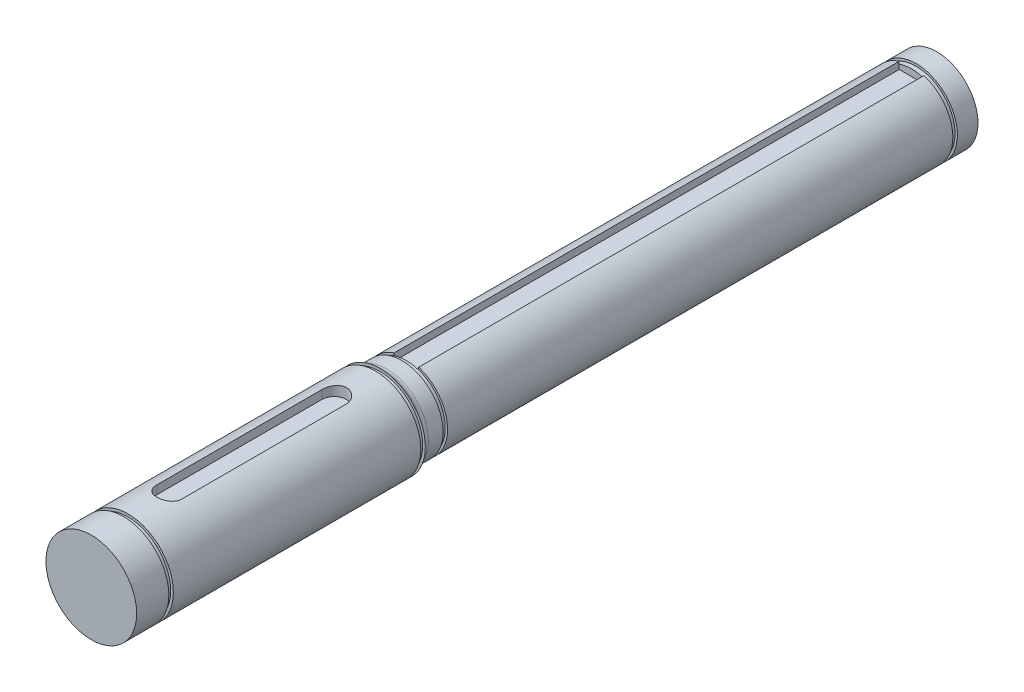
ISO-10303-21;
HEADER;
FILE_DESCRIPTION(('STEP AP214'),'2;1');
FILE_NAME('part.step','',(''),(''),'','','');
FILE_SCHEMA(('AUTOMOTIVE_DESIGN { 1 0 10303 214 1 1 1 1 }'));
ENDSEC;
DATA;
#1=APPLICATION_CONTEXT('core data for automotive mechanical design processes');
#2=APPLICATION_PROTOCOL_DEFINITION('international standard','automotive_design',2000,#1);
#3=PRODUCT_CONTEXT('',#1,'mechanical');
#4=PRODUCT('Part','Part','',(#3));
#5=PRODUCT_RELATED_PRODUCT_CATEGORY('part','',(#4));
#6=PRODUCT_DEFINITION_FORMATION('','',#4);
#7=PRODUCT_DEFINITION_CONTEXT('part definition',#1,'design');
#8=PRODUCT_DEFINITION('design','',#6,#7);
#9=PRODUCT_DEFINITION_SHAPE('','',#8);
#10=(LENGTH_UNIT() NAMED_UNIT(*) SI_UNIT(.MILLI.,.METRE.));
#11=(NAMED_UNIT(*) PLANE_ANGLE_UNIT() SI_UNIT($,.RADIAN.));
#12=(NAMED_UNIT(*) SI_UNIT($,.STERADIAN.) SOLID_ANGLE_UNIT());
#13=UNCERTAINTY_MEASURE_WITH_UNIT(LENGTH_MEASURE(1.E-05),#10,'distance_accuracy_value','');
#14=(GEOMETRIC_REPRESENTATION_CONTEXT(3) GLOBAL_UNCERTAINTY_ASSIGNED_CONTEXT((#13)) GLOBAL_UNIT_ASSIGNED_CONTEXT((#10,
#11,#12)) REPRESENTATION_CONTEXT('',''));
#15=CARTESIAN_POINT('',(0.,0.,0.));
#16=DIRECTION('',(0.,0.,1.));
#17=DIRECTION('',(1.,0.,0.));
#18=AXIS2_PLACEMENT_3D('',#15,#16,#17);
#19=CARTESIAN_POINT('',(0.,0.,135.));
#20=DIRECTION('',(0.,0.,-1.));
#21=DIRECTION('',(-1.,0.,0.));
#22=AXIS2_PLACEMENT_3D('',#19,#20,#21);
#23=CYLINDRICAL_SURFACE('',#22,10.);
#24=CARTESIAN_POINT('',(0.,0.,128.6));
#25=DIRECTION('',(0.,0.,-1.));
#26=DIRECTION('',(-1.,0.,0.));
#27=AXIS2_PLACEMENT_3D('',#24,#25,#26);
#28=CIRCLE('',#27,10.);
#29=CARTESIAN_POINT('',(3.,9.53939201416946,128.6));
#30=VERTEX_POINT('',#29);
#31=CARTESIAN_POINT('',(-3.,9.53939201416946,128.6));
#32=VERTEX_POINT('',#31);
#33=EDGE_CURVE('E240',#30,#32,#28,.T.);
#34=ORIENTED_EDGE('',*,*,#33,.T.);
#35=DIRECTION('',(0.,0.,-1.));
#36=VECTOR('',#35,1.);
#37=CARTESIAN_POINT('',(-3.,9.53939201416946,135.));
#38=LINE('',#37,#36);
#39=CARTESIAN_POINT('',(-3.,9.53939201416946,6.10000000000001));
#40=VERTEX_POINT('',#39);
#41=EDGE_CURVE('E227',#32,#40,#38,.T.);
#42=ORIENTED_EDGE('',*,*,#41,.T.);
#43=CARTESIAN_POINT('',(0.,0.,6.1));
#44=DIRECTION('',(0.,0.,-1.));
#45=DIRECTION('',(-1.,0.,0.));
#46=AXIS2_PLACEMENT_3D('',#43,#44,#45);
#47=CIRCLE('',#46,10.);
#48=CARTESIAN_POINT('',(3.,9.53939201416946,6.10000000000001));
#49=VERTEX_POINT('',#48);
#50=EDGE_CURVE('E257',#49,#40,#47,.T.);
#51=ORIENTED_EDGE('',*,*,#50,.F.);
#52=DIRECTION('',(0.,0.,-1.));
#53=VECTOR('',#52,1.);
#54=CARTESIAN_POINT('',(3.,9.53939201416946,135.));
#55=LINE('',#54,#53);
#56=EDGE_CURVE('E220',#49,#30,#55,.F.);
#57=ORIENTED_EDGE('',*,*,#56,.T.);
#58=EDGE_LOOP('',(#34,#42,#51,#57));
#59=FACE_BOUND('',#58,.T.);
#60=ADVANCED_FACE('F39',(#59),#23,.T.);
#61=CARTESIAN_POINT('',(0.,0.,6.1));
#62=DIRECTION('',(0.,0.,-1.));
#63=DIRECTION('',(-1.,0.,0.));
#64=AXIS2_PLACEMENT_3D('',#61,#62,#63);
#65=PLANE('',#64);
#66=DIRECTION('',(0.,1.,0.));
#67=VECTOR('',#66,1.);
#68=CARTESIAN_POINT('',(-3.,10.8777926354471,6.10000000000001));
#69=LINE('',#68,#67);
#70=CARTESIAN_POINT('',(-3.,8.94007270663947,6.10000000000001));
#71=VERTEX_POINT('',#70);
#72=EDGE_CURVE('E193',#71,#40,#69,.T.);
#73=ORIENTED_EDGE('',*,*,#72,.F.);
#74=CARTESIAN_POINT('',(0.,0.,6.1));
#75=DIRECTION('',(0.,0.,-1.));
#76=DIRECTION('',(-1.,0.,0.));
#77=AXIS2_PLACEMENT_3D('',#74,#75,#76);
#78=CIRCLE('',#77,9.43);
#79=CARTESIAN_POINT('',(3.,8.94007270663947,6.10000000000001));
#80=VERTEX_POINT('',#79);
#81=EDGE_CURVE('E253',#80,#71,#78,.T.);
#82=ORIENTED_EDGE('',*,*,#81,.F.);
#83=DIRECTION('',(0.,-1.,0.));
#84=VECTOR('',#83,1.);
#85=CARTESIAN_POINT('',(3.,7.81,6.10000000000001));
#86=LINE('',#85,#84);
#87=EDGE_CURVE('E212',#49,#80,#86,.T.);
#88=ORIENTED_EDGE('',*,*,#87,.F.);
#89=ORIENTED_EDGE('',*,*,#50,.T.);
#90=EDGE_LOOP('',(#73,#82,#88,#89));
#91=FACE_BOUND('',#90,.T.);
#92=ADVANCED_FACE('F335',(#91),#65,.T.);
#93=CARTESIAN_POINT('',(0.,0.,5.));
#94=DIRECTION('',(0.,0.,-1.));
#95=DIRECTION('',(-1.,0.,0.));
#96=AXIS2_PLACEMENT_3D('',#93,#94,#95);
#97=PLANE('',#96);
#98=CARTESIAN_POINT('',(0.,0.,5.));
#99=DIRECTION('',(0.,0.,-1.));
#100=DIRECTION('',(-1.,0.,0.));
#101=AXIS2_PLACEMENT_3D('',#98,#99,#100);
#102=CIRCLE('',#101,9.43);
#103=CARTESIAN_POINT('',(-9.43,0.,5.));
#104=VERTEX_POINT('',#103);
#105=EDGE_CURVE('E244',#104,#104,#102,.T.);
#106=ORIENTED_EDGE('',*,*,#105,.T.);
#107=EDGE_LOOP('',(#106));
#108=FACE_BOUND('',#107,.T.);
#109=CARTESIAN_POINT('',(0.,0.,5.));
#110=DIRECTION('',(0.,0.,-1.));
#111=DIRECTION('',(-1.,0.,0.));
#112=AXIS2_PLACEMENT_3D('',#109,#110,#111);
#113=CIRCLE('',#112,10.);
#114=CARTESIAN_POINT('',(-10.,0.,5.));
#115=VERTEX_POINT('',#114);
#116=EDGE_CURVE('E252',#115,#115,#113,.T.);
#117=ORIENTED_EDGE('',*,*,#116,.F.);
#118=EDGE_LOOP('',(#117));
#119=FACE_BOUND('',#118,.T.);
#120=ADVANCED_FACE('F342',(#108,#119),#97,.F.);
#121=CARTESIAN_POINT('',(0.,0.,6.1));
#122=DIRECTION('',(0.,0.,-1.));
#123=DIRECTION('',(-1.,0.,0.));
#124=AXIS2_PLACEMENT_3D('',#121,#122,#123);
#125=CYLINDRICAL_SURFACE('',#124,9.43);
#126=EDGE_CURVE('E248',#71,#80,#78,.T.);
#127=ORIENTED_EDGE('',*,*,#126,.T.);
#128=ORIENTED_EDGE('',*,*,#81,.T.);
#129=EDGE_LOOP('',(#127,#128));
#130=FACE_BOUND('',#129,.T.);
#131=ORIENTED_EDGE('',*,*,#105,.F.);
#132=EDGE_LOOP('',(#131));
#133=FACE_BOUND('',#132,.T.);
#134=ADVANCED_FACE('F361',(#130,#133),#125,.T.);
#135=CARTESIAN_POINT('',(0.,0.,0.));
#136=DIRECTION('',(0.,0.,1.));
#137=DIRECTION('',(1.,0.,0.));
#138=AXIS2_PLACEMENT_3D('',#135,#136,#137);
#139=PLANE('',#138);
#140=CARTESIAN_POINT('',(0.,0.,0.));
#141=DIRECTION('',(0.,0.,1.));
#142=DIRECTION('',(1.,0.,0.));
#143=AXIS2_PLACEMENT_3D('',#140,#141,#142);
#144=CIRCLE('',#143,10.);
#145=CARTESIAN_POINT('',(10.,0.,0.));
#146=VERTEX_POINT('',#145);
#147=EDGE_CURVE('E261',#146,#146,#144,.T.);
#148=ORIENTED_EDGE('',*,*,#147,.F.);
#149=EDGE_LOOP('',(#148));
#150=FACE_BOUND('',#149,.T.);
#151=ADVANCED_FACE('F352',(#150),#139,.F.);
#152=ORIENTED_EDGE('',*,*,#116,.T.);
#153=EDGE_LOOP('',(#152));
#154=FACE_BOUND('',#153,.T.);
#155=ORIENTED_EDGE('',*,*,#147,.T.);
#156=EDGE_LOOP('',(#155));
#157=FACE_BOUND('',#156,.T.);
#158=ADVANCED_FACE('F338',(#154,#157),#23,.T.);
#159=CARTESIAN_POINT('',(0.,0.,128.6));
#160=DIRECTION('',(0.,0.,1.));
#161=DIRECTION('',(-1.,0.,0.));
#162=AXIS2_PLACEMENT_3D('',#159,#160,#161);
#163=PLANE('',#162);
#164=DIRECTION('',(0.,1.,0.));
#165=VECTOR('',#164,1.);
#166=CARTESIAN_POINT('',(-3.,10.8777926354471,128.6));
#167=LINE('',#166,#165);
#168=CARTESIAN_POINT('',(-3.,8.94007270663947,128.6));
#169=VERTEX_POINT('',#168);
#170=EDGE_CURVE('E197',#169,#32,#167,.T.);
#171=ORIENTED_EDGE('',*,*,#170,.T.);
#172=ORIENTED_EDGE('',*,*,#33,.F.);
#173=DIRECTION('',(0.,-1.,0.));
#174=VECTOR('',#173,1.);
#175=CARTESIAN_POINT('',(3.,7.81,128.6));
#176=LINE('',#175,#174);
#177=CARTESIAN_POINT('',(3.,8.94007270663947,128.6));
#178=VERTEX_POINT('',#177);
#179=EDGE_CURVE('E200',#30,#178,#176,.T.);
#180=ORIENTED_EDGE('',*,*,#179,.T.);
#181=CARTESIAN_POINT('',(0.,0.,128.6));
#182=DIRECTION('',(0.,0.,-1.));
#183=DIRECTION('',(-1.,0.,0.));
#184=AXIS2_PLACEMENT_3D('',#181,#182,#183);
#185=CIRCLE('',#184,9.43);
#186=EDGE_CURVE('E236',#178,#169,#185,.T.);
#187=ORIENTED_EDGE('',*,*,#186,.T.);
#188=EDGE_LOOP('',(#171,#172,#180,#187));
#189=FACE_BOUND('',#188,.T.);
#190=ADVANCED_FACE('F351',(#189),#163,.T.);
#191=CARTESIAN_POINT('',(0.,0.,129.7));
#192=DIRECTION('',(0.,0.,1.));
#193=DIRECTION('',(-1.,0.,0.));
#194=AXIS2_PLACEMENT_3D('',#191,#192,#193);
#195=PLANE('',#194);
#196=CARTESIAN_POINT('',(0.,0.,129.7));
#197=DIRECTION('',(0.,0.,-1.));
#198=DIRECTION('',(-1.,0.,0.));
#199=AXIS2_PLACEMENT_3D('',#196,#197,#198);
#200=CIRCLE('',#199,10.);
#201=CARTESIAN_POINT('',(-10.,0.,129.7));
#202=VERTEX_POINT('',#201);
#203=EDGE_CURVE('E235',#202,#202,#200,.T.);
#204=ORIENTED_EDGE('',*,*,#203,.T.);
#205=EDGE_LOOP('',(#204));
#206=FACE_BOUND('',#205,.T.);
#207=CARTESIAN_POINT('',(0.,0.,129.7));
#208=DIRECTION('',(0.,0.,-1.));
#209=DIRECTION('',(-1.,0.,0.));
#210=AXIS2_PLACEMENT_3D('',#207,#208,#209);
#211=CIRCLE('',#210,9.43);
#212=CARTESIAN_POINT('',(-9.43,0.,129.7));
#213=VERTEX_POINT('',#212);
#214=EDGE_CURVE('E231',#213,#213,#211,.T.);
#215=ORIENTED_EDGE('',*,*,#214,.F.);
#216=EDGE_LOOP('',(#215));
#217=FACE_BOUND('',#216,.T.);
#218=ADVANCED_FACE('F358',(#206,#217),#195,.F.);
#219=CARTESIAN_POINT('',(0.,0.,128.6));
#220=DIRECTION('',(0.,0.,1.));
#221=DIRECTION('',(1.,0.,0.));
#222=AXIS2_PLACEMENT_3D('',#219,#220,#221);
#223=CYLINDRICAL_SURFACE('',#222,9.43);
#224=EDGE_CURVE('E232',#169,#178,#185,.T.);
#225=ORIENTED_EDGE('',*,*,#224,.F.);
#226=ORIENTED_EDGE('',*,*,#186,.F.);
#227=EDGE_LOOP('',(#225,#226));
#228=FACE_BOUND('',#227,.T.);
#229=ORIENTED_EDGE('',*,*,#214,.T.);
#230=EDGE_LOOP('',(#229));
#231=FACE_BOUND('',#230,.T.);
#232=ADVANCED_FACE('F348',(#228,#231),#223,.T.);
#233=CARTESIAN_POINT('',(0.,0.,133.267949192431));
#234=DIRECTION('',(0.,0.,1.));
#235=DIRECTION('',(1.,0.,0.));
#236=AXIS2_PLACEMENT_3D('',#233,#234,#235);
#237=CIRCLE('',#236,10.);
#238=CARTESIAN_POINT('',(10.,0.,133.267949192431));
#239=VERTEX_POINT('',#238);
#240=EDGE_CURVE('E268',#239,#239,#237,.F.);
#241=ORIENTED_EDGE('',*,*,#240,.T.);
#242=EDGE_LOOP('',(#241));
#243=FACE_BOUND('',#242,.T.);
#244=ORIENTED_EDGE('',*,*,#203,.F.);
#245=EDGE_LOOP('',(#244));
#246=FACE_BOUND('',#245,.T.);
#247=ADVANCED_FACE('F337',(#243,#246),#23,.T.);
#248=CARTESIAN_POINT('',(-3.,10.8777926354471,128.6));
#249=DIRECTION('',(-1.,0.,0.));
#250=DIRECTION('',(0.,0.,1.));
#251=AXIS2_PLACEMENT_3D('',#248,#249,#250);
#252=PLANE('',#251);
#253=ORIENTED_EDGE('',*,*,#170,.F.);
#254=CARTESIAN_POINT('',(-3.,7.81,128.6));
#255=VERTEX_POINT('',#254);
#256=EDGE_CURVE('E63',#255,#169,#167,.T.);
#257=ORIENTED_EDGE('',*,*,#256,.F.);
#258=DIRECTION('',(0.,0.,-1.));
#259=VECTOR('',#258,1.);
#260=CARTESIAN_POINT('',(-3.,7.81,128.6));
#261=LINE('',#260,#259);
#262=CARTESIAN_POINT('',(-3.,7.81,6.10000000000001));
#263=VERTEX_POINT('',#262);
#264=EDGE_CURVE('E217',#255,#263,#261,.T.);
#265=ORIENTED_EDGE('',*,*,#264,.T.);
#266=EDGE_CURVE('E205',#263,#71,#69,.T.);
#267=ORIENTED_EDGE('',*,*,#266,.T.);
#268=ORIENTED_EDGE('',*,*,#72,.T.);
#269=ORIENTED_EDGE('',*,*,#41,.F.);
#270=EDGE_LOOP('',(#253,#257,#265,#267,#268,#269));
#271=FACE_BOUND('',#270,.T.);
#272=ADVANCED_FACE('F347',(#271),#252,.F.);
#273=CARTESIAN_POINT('',(3.,7.81,128.6));
#274=DIRECTION('',(1.,0.,0.));
#275=DIRECTION('',(0.,0.,-1.));
#276=AXIS2_PLACEMENT_3D('',#273,#274,#275);
#277=PLANE('',#276);
#278=ORIENTED_EDGE('',*,*,#87,.T.);
#279=CARTESIAN_POINT('',(3.,7.81,6.10000000000001));
#280=VERTEX_POINT('',#279);
#281=EDGE_CURVE('E209',#80,#280,#86,.T.);
#282=ORIENTED_EDGE('',*,*,#281,.T.);
#283=DIRECTION('',(0.,0.,-1.));
#284=VECTOR('',#283,1.);
#285=CARTESIAN_POINT('',(3.,7.81,128.6));
#286=LINE('',#285,#284);
#287=CARTESIAN_POINT('',(3.,7.81,128.6));
#288=VERTEX_POINT('',#287);
#289=EDGE_CURVE('E204',#288,#280,#286,.T.);
#290=ORIENTED_EDGE('',*,*,#289,.F.);
#291=EDGE_CURVE('E196',#178,#288,#176,.T.);
#292=ORIENTED_EDGE('',*,*,#291,.F.);
#293=ORIENTED_EDGE('',*,*,#179,.F.);
#294=ORIENTED_EDGE('',*,*,#56,.F.);
#295=EDGE_LOOP('',(#278,#282,#290,#292,#293,#294));
#296=FACE_BOUND('',#295,.T.);
#297=ADVANCED_FACE('F384',(#296),#277,.F.);
#298=CARTESIAN_POINT('',(0.,0.,128.6));
#299=DIRECTION('',(0.,0.,-1.));
#300=DIRECTION('',(-1.,0.,0.));
#301=AXIS2_PLACEMENT_3D('',#298,#299,#300);
#302=PLANE('',#301);
#303=ORIENTED_EDGE('',*,*,#224,.T.);
#304=ORIENTED_EDGE('',*,*,#291,.T.);
#305=DIRECTION('',(-1.,0.,0.));
#306=VECTOR('',#305,1.);
#307=CARTESIAN_POINT('',(3.,7.81,128.6));
#308=LINE('',#307,#306);
#309=EDGE_CURVE('E201',#288,#255,#308,.T.);
#310=ORIENTED_EDGE('',*,*,#309,.T.);
#311=ORIENTED_EDGE('',*,*,#256,.T.);
#312=EDGE_LOOP('',(#303,#304,#310,#311));
#313=FACE_BOUND('',#312,.T.);
#314=ADVANCED_FACE('F388',(#313),#302,.T.);
#315=CARTESIAN_POINT('',(3.,7.81,128.6));
#316=DIRECTION('',(0.,-1.,0.));
#317=DIRECTION('',(1.,0.,0.));
#318=AXIS2_PLACEMENT_3D('',#315,#316,#317);
#319=PLANE('',#318);
#320=DIRECTION('',(-1.,0.,0.));
#321=VECTOR('',#320,1.);
#322=CARTESIAN_POINT('',(3.,7.81,6.10000000000001));
#323=LINE('',#322,#321);
#324=EDGE_CURVE('E213',#280,#263,#323,.T.);
#325=ORIENTED_EDGE('',*,*,#324,.T.);
#326=ORIENTED_EDGE('',*,*,#264,.F.);
#327=ORIENTED_EDGE('',*,*,#309,.F.);
#328=ORIENTED_EDGE('',*,*,#289,.T.);
#329=EDGE_LOOP('',(#325,#326,#327,#328));
#330=FACE_BOUND('',#329,.T.);
#331=ADVANCED_FACE('F390',(#330),#319,.F.);
#332=CARTESIAN_POINT('',(0.,0.,6.10000000000001));
#333=DIRECTION('',(0.,0.,-1.));
#334=DIRECTION('',(-1.,0.,0.));
#335=AXIS2_PLACEMENT_3D('',#332,#333,#334);
#336=PLANE('',#335);
#337=ORIENTED_EDGE('',*,*,#126,.F.);
#338=ORIENTED_EDGE('',*,*,#266,.F.);
#339=ORIENTED_EDGE('',*,*,#324,.F.);
#340=ORIENTED_EDGE('',*,*,#281,.F.);
#341=EDGE_LOOP('',(#337,#338,#339,#340));
#342=FACE_BOUND('',#341,.T.);
#343=ADVANCED_FACE('F393',(#342),#336,.F.);
#344=CARTESIAN_POINT('',(0.,0.,133.267949192431));
#345=DIRECTION('',(0.,0.,1.));
#346=DIRECTION('',(1.,0.,0.));
#347=AXIS2_PLACEMENT_3D('',#344,#345,#346);
#348=TOROIDAL_SURFACE('',#347,12.,2.);
#349=ORIENTED_EDGE('',*,*,#240,.F.);
#350=EDGE_LOOP('',(#349));
#351=FACE_BOUND('',#350,.T.);
#352=CARTESIAN_POINT('',(0.,0.,135.));
#353=DIRECTION('',(0.,0.,1.));
#354=DIRECTION('',(1.,0.,0.));
#355=AXIS2_PLACEMENT_3D('',#352,#353,#354);
#356=CIRCLE('',#355,11.);
#357=CARTESIAN_POINT('',(11.,0.,135.));
#358=VERTEX_POINT('',#357);
#359=EDGE_CURVE('E178',#358,#358,#356,.T.);
#360=ORIENTED_EDGE('',*,*,#359,.F.);
#361=EDGE_LOOP('',(#360));
#362=FACE_BOUND('',#361,.T.);
#363=ADVANCED_FACE('F41',(#351,#362),#348,.F.);
#364=CARTESIAN_POINT('',(0.,0.,136.1));
#365=DIRECTION('',(0.,0.,1.));
#366=DIRECTION('',(1.,0.,0.));
#367=AXIS2_PLACEMENT_3D('',#364,#365,#366);
#368=PLANE('',#367);
#369=CARTESIAN_POINT('',(0.,0.,136.1));
#370=DIRECTION('',(0.,0.,1.));
#371=DIRECTION('',(1.,0.,0.));
#372=AXIS2_PLACEMENT_3D('',#369,#370,#371);
#373=CIRCLE('',#372,11.);
#374=CARTESIAN_POINT('',(11.,0.,136.1));
#375=VERTEX_POINT('',#374);
#376=EDGE_CURVE('E182',#375,#375,#373,.T.);
#377=ORIENTED_EDGE('',*,*,#376,.F.);
#378=EDGE_LOOP('',(#377));
#379=FACE_BOUND('',#378,.T.);
#380=CARTESIAN_POINT('',(0.,0.,136.1));
#381=DIRECTION('',(0.,0.,1.));
#382=DIRECTION('',(1.,0.,0.));
#383=AXIS2_PLACEMENT_3D('',#380,#381,#382);
#384=CIRCLE('',#383,10.35);
#385=CARTESIAN_POINT('',(10.35,0.,136.1));
#386=VERTEX_POINT('',#385);
#387=EDGE_CURVE('E174',#386,#386,#384,.T.);
#388=ORIENTED_EDGE('',*,*,#387,.T.);
#389=EDGE_LOOP('',(#388));
#390=FACE_BOUND('',#389,.T.);
#391=ADVANCED_FACE('F322',(#379,#390),#368,.F.);
#392=CARTESIAN_POINT('',(0.,0.,135.));
#393=DIRECTION('',(0.,0.,1.));
#394=DIRECTION('',(1.,0.,0.));
#395=AXIS2_PLACEMENT_3D('',#392,#393,#394);
#396=PLANE('',#395);
#397=ORIENTED_EDGE('',*,*,#359,.T.);
#398=EDGE_LOOP('',(#397));
#399=FACE_BOUND('',#398,.T.);
#400=CARTESIAN_POINT('',(0.,0.,135.));
#401=DIRECTION('',(0.,0.,1.));
#402=DIRECTION('',(1.,0.,0.));
#403=AXIS2_PLACEMENT_3D('',#400,#401,#402);
#404=CIRCLE('',#403,10.35);
#405=CARTESIAN_POINT('',(10.35,0.,135.));
#406=VERTEX_POINT('',#405);
#407=EDGE_CURVE('E170',#406,#406,#404,.T.);
#408=ORIENTED_EDGE('',*,*,#407,.F.);
#409=EDGE_LOOP('',(#408));
#410=FACE_BOUND('',#409,.T.);
#411=ADVANCED_FACE('F320',(#399,#410),#396,.T.);
#412=CARTESIAN_POINT('',(0.,0.,136.1));
#413=DIRECTION('',(0.,0.,-1.));
#414=DIRECTION('',(-1.,0.,0.));
#415=AXIS2_PLACEMENT_3D('',#412,#413,#414);
#416=CYLINDRICAL_SURFACE('',#415,10.35);
#417=ORIENTED_EDGE('',*,*,#387,.F.);
#418=EDGE_LOOP('',(#417));
#419=FACE_BOUND('',#418,.T.);
#420=ORIENTED_EDGE('',*,*,#407,.T.);
#421=EDGE_LOOP('',(#420));
#422=FACE_BOUND('',#421,.T.);
#423=ADVANCED_FACE('F317',(#419,#422),#416,.T.);
#424=CARTESIAN_POINT('',(0.,0.,205.));
#425=DIRECTION('',(0.,0.,-1.));
#426=DIRECTION('',(-1.,0.,0.));
#427=AXIS2_PLACEMENT_3D('',#424,#425,#426);
#428=CYLINDRICAL_SURFACE('',#427,11.);
#429=DIRECTION('',(0.,0.,-1.));
#430=VECTOR('',#429,1.);
#431=CARTESIAN_POINT('',(3.00000000000001,10.5830052442584,205.));
#432=LINE('',#431,#430);
#433=CARTESIAN_POINT('',(3.,10.5830052442584,146.1));
#434=VERTEX_POINT('',#433);
#435=CARTESIAN_POINT('',(3.,10.5830052442584,186.1));
#436=VERTEX_POINT('',#435);
#437=EDGE_CURVE('E11',#434,#436,#432,.F.);
#438=ORIENTED_EDGE('',*,*,#437,.T.);
#439=CARTESIAN_POINT('',(3.,10.5830052442584,186.1));
#440=CARTESIAN_POINT('',(3.00000989976809,10.5829949970026,186.18269389141));
#441=CARTESIAN_POINT('',(2.99658102723595,10.5839742471726,186.265381704592));
#442=CARTESIAN_POINT('',(2.98292268314841,10.5878356752194,186.430133566229));
#443=CARTESIAN_POINT('',(2.97269452008914,10.5907174869552,186.512197731629));
#444=CARTESIAN_POINT('',(2.94554459027321,10.5982996181419,186.674942512145));
#445=CARTESIAN_POINT('',(2.9286377012691,10.6029958951229,186.755625789386));
#446=CARTESIAN_POINT('',(2.8882912071269,10.6140571066224,186.915203254054));
#447=CARTESIAN_POINT('',(2.8648514776895,10.6204220728906,186.994097407408));
#448=CARTESIAN_POINT('',(2.78500332821794,10.6417494872311,187.227242907164));
#449=CARTESIAN_POINT('',(2.71903526586308,10.6589535681767,187.378139394855));
#450=CARTESIAN_POINT('',(2.56365897700126,10.6973836998985,187.666705341769));
#451=CARTESIAN_POINT('',(2.47424245636571,10.7186111730805,187.804370097104));
#452=CARTESIAN_POINT('',(2.27200424315805,10.7633148792344,188.066209705979));
#453=CARTESIAN_POINT('',(2.15868225262836,10.7868322128172,188.189991878244));
#454=CARTESIAN_POINT('',(1.91292298422355,10.8331129950831,188.417051438905));
#455=CARTESIAN_POINT('',(1.78048258944452,10.8558763200935,188.520325477293));
#456=CARTESIAN_POINT('',(1.49749198480952,10.8985459264206,188.705098906746));
#457=CARTESIAN_POINT('',(1.34667477161623,10.9183977479742,188.786203079821));
#458=CARTESIAN_POINT('',(1.03291980522386,10.9525311229674,188.92174841378));
#459=CARTESIAN_POINT('',(0.869984764533401,10.9668139185607,188.976195521132));
#460=CARTESIAN_POINT('',(0.540744675896723,10.9879090070619,189.055601734903));
#461=CARTESIAN_POINT('',(0.374613167612539,10.9948916417093,189.081234326369));
#462=CARTESIAN_POINT('',(0.0402673813620262,11.0011960589752,189.104404664847));
#463=CARTESIAN_POINT('',(-0.127946573564688,11.0005190152883,189.101946716178));
#464=CARTESIAN_POINT('',(-0.45698092440425,10.9917041066205,189.069475124185));
#465=CARTESIAN_POINT('',(-0.617879308918083,10.9837634920705,189.040189973227));
#466=CARTESIAN_POINT('',(-0.932383527853141,10.9615477415639,188.956074784141));
#467=CARTESIAN_POINT('',(-1.08598900853898,10.9472722986892,188.901243508315));
#468=CARTESIAN_POINT('',(-1.38338788045076,10.9137016176963,188.767045133193));
#469=CARTESIAN_POINT('',(-1.52706425574144,10.8943563157114,188.687431753761));
#470=CARTESIAN_POINT('',(-1.79926098198643,10.8527253375081,188.506120130093));
#471=CARTESIAN_POINT('',(-1.92777854091953,10.830439121215,188.404417827188));
#472=CARTESIAN_POINT('',(-2.17034844112029,10.7844948742978,188.177976764916));
#473=CARTESIAN_POINT('',(-2.28380693028891,10.760815765188,188.052605446131));
#474=CARTESIAN_POINT('',(-2.48826234185507,10.7153886222241,187.78433761913));
#475=CARTESIAN_POINT('',(-2.57925300980782,10.6936411271563,187.641436247546));
#476=CARTESIAN_POINT('',(-2.73667910615422,10.6544469945807,187.340805187246));
#477=CARTESIAN_POINT('',(-2.80293223890785,10.6370325899538,187.182975757243));
#478=CARTESIAN_POINT('',(-2.9076832432578,10.6088816209578,186.857912905473));
#479=CARTESIAN_POINT('',(-2.94622291362359,10.598135003286,186.690694057725));
#480=CARTESIAN_POINT('',(-2.98015870664206,10.588613232355,186.451645560133));
#481=CARTESIAN_POINT('',(-2.9875996214126,10.5865140551644,186.381483540276));
#482=CARTESIAN_POINT('',(-2.99751512863221,10.58371035186,186.24089244676));
#483=CARTESIAN_POINT('',(-2.99999749605756,10.5830036423878,186.170463964942));
#484=CARTESIAN_POINT('',(-2.99999999999999,10.5830052442584,186.1));
#485=B_SPLINE_CURVE_WITH_KNOTS('',3,(#439,#440,#441,#442,#443,#444,#445,#446,#447,#448,#449,
#450,#451,#452,#453,#454,#455,#456,#457,#458,#459,#460,#461,#462,#463,#464,#465,#466,#467,#468,
#469,#470,#471,#472,#473,#474,#475,#476,#477,#478,#479,#480,#481,#482,#483,#484),.UNSPECIFIED.,
.F.,.F.,(4,2,2,2,2,2,2,2,2,2,2,2,2,2,2,2,2,2,2,2,2,2,4),(0.,0.247994395628672,0.49594107954413,
0.743338515979064,0.99074065992621,1.48499724217182,1.97942888795734,2.4854708385663,
2.99159538337129,3.50622794981869,4.02074566333959,4.52296979924473,5.02511698025349,
5.51402000992995,6.00294672920888,6.49689640600088,6.99093691914145,7.50077286033221,
8.01075056671348,8.5244155087371,9.0373040824346,9.24891043373582,9.46018472611219),.UNSPECIFIED.);
#486=CARTESIAN_POINT('',(-2.99999999999999,10.5830052442584,186.1));
#487=VERTEX_POINT('',#486);
#488=EDGE_CURVE('E272',#436,#487,#485,.T.);
#489=ORIENTED_EDGE('',*,*,#488,.T.);
#490=DIRECTION('',(0.,0.,-1.));
#491=VECTOR('',#490,1.);
#492=CARTESIAN_POINT('',(-2.99999999999999,10.5830052442584,205.));
#493=LINE('',#492,#491);
#494=CARTESIAN_POINT('',(-2.99999999999999,10.5830052442584,146.1));
#495=VERTEX_POINT('',#494);
#496=EDGE_CURVE('E48',#487,#495,#493,.T.);
#497=ORIENTED_EDGE('',*,*,#496,.T.);
#498=CARTESIAN_POINT('',(-3.,10.5830052442584,146.1));
#499=CARTESIAN_POINT('',(-3.00000989976809,10.5829949970026,146.01730610859));
#500=CARTESIAN_POINT('',(-2.99658102723594,10.5839742471726,145.934618295408));
#501=CARTESIAN_POINT('',(-2.98292268314841,10.5878356752194,145.769866433771));
#502=CARTESIAN_POINT('',(-2.97269452008914,10.5907174869552,145.687802268371));
#503=CARTESIAN_POINT('',(-2.9455445902732,10.598299618142,145.525057487855));
#504=CARTESIAN_POINT('',(-2.92863770126909,10.6029958951229,145.444374210614));
#505=CARTESIAN_POINT('',(-2.88829120712689,10.6140571066224,145.284796745946));
#506=CARTESIAN_POINT('',(-2.86485147768949,10.6204220728906,145.205902592592));
#507=CARTESIAN_POINT('',(-2.78500332821793,10.6417494872311,144.972757092836));
#508=CARTESIAN_POINT('',(-2.71903526586306,10.6589535681767,144.821860605145));
#509=CARTESIAN_POINT('',(-2.56365897700124,10.6973836998985,144.533294658231));
#510=CARTESIAN_POINT('',(-2.47424245636571,10.7186111730806,144.395629902896));
#511=CARTESIAN_POINT('',(-2.27200424315805,10.7633148792344,144.133790294021));
#512=CARTESIAN_POINT('',(-2.15868225262835,10.7868322128172,144.010008121756));
#513=CARTESIAN_POINT('',(-1.91292298422353,10.8331129950831,143.782948561095));
#514=CARTESIAN_POINT('',(-1.78048258944452,10.8558763200935,143.679674522707));
#515=CARTESIAN_POINT('',(-1.49749198480951,10.8985459264206,143.494901093254));
#516=CARTESIAN_POINT('',(-1.34667477161623,10.9183977479742,143.413796920179));
#517=CARTESIAN_POINT('',(-1.03291980522386,10.9525311229674,143.27825158622));
#518=CARTESIAN_POINT('',(-0.869984764533397,10.9668139185607,143.223804478868));
#519=CARTESIAN_POINT('',(-0.540744675896719,10.9879090070619,143.144398265097));
#520=CARTESIAN_POINT('',(-0.374613167612534,10.9948916417093,143.118765673631));
#521=CARTESIAN_POINT('',(-0.0402673813620209,11.0011960589752,143.095595335153));
#522=CARTESIAN_POINT('',(0.127946573564694,11.0005190152883,143.098053283822));
#523=CARTESIAN_POINT('',(0.456980924404253,10.9917041066205,143.130524875815));
#524=CARTESIAN_POINT('',(0.617879308918084,10.9837634920705,143.159810026773));
#525=CARTESIAN_POINT('',(0.932383527853142,10.9615477415639,143.243925215859));
#526=CARTESIAN_POINT('',(1.08598900853898,10.9472722986892,143.298756491685));
#527=CARTESIAN_POINT('',(1.38338788045077,10.9137016176963,143.432954866807));
#528=CARTESIAN_POINT('',(1.52706425574145,10.8943563157114,143.512568246239));
#529=CARTESIAN_POINT('',(1.79926098198644,10.8527253375081,143.693879869907));
#530=CARTESIAN_POINT('',(1.92777854091954,10.830439121215,143.795582172812));
#531=CARTESIAN_POINT('',(2.1703484411203,10.7844948742978,144.022023235084));
#532=CARTESIAN_POINT('',(2.28380693028892,10.760815765188,144.147394553869));
#533=CARTESIAN_POINT('',(2.48826234185508,10.7153886222241,144.41566238087));
#534=CARTESIAN_POINT('',(2.57925300980783,10.6936411271563,144.558563752454));
#535=CARTESIAN_POINT('',(2.73667910615423,10.6544469945807,144.859194812754));
#536=CARTESIAN_POINT('',(2.80293223890787,10.6370325899538,145.017024242757));
#537=CARTESIAN_POINT('',(2.90768324325781,10.6088816209578,145.342087094527));
#538=CARTESIAN_POINT('',(2.9462229136236,10.598135003286,145.509305942275));
#539=CARTESIAN_POINT('',(2.98015870664207,10.588613232355,145.748354439867));
#540=CARTESIAN_POINT('',(2.98759962141261,10.5865140551644,145.818516459724));
#541=CARTESIAN_POINT('',(2.99751512863222,10.58371035186,145.95910755324));
#542=CARTESIAN_POINT('',(2.99999749605757,10.5830036423878,146.029536035058));
#543=CARTESIAN_POINT('',(3.,10.5830052442584,146.1));
#544=B_SPLINE_CURVE_WITH_KNOTS('',3,(#498,#499,#500,#501,#502,#503,#504,#505,#506,#507,#508,
#509,#510,#511,#512,#513,#514,#515,#516,#517,#518,#519,#520,#521,#522,#523,#524,#525,#526,#527,
#528,#529,#530,#531,#532,#533,#534,#535,#536,#537,#538,#539,#540,#541,#542,#543),.UNSPECIFIED.,
.F.,.F.,(4,2,2,2,2,2,2,2,2,2,2,2,2,2,2,2,2,2,2,2,2,2,4),(0.,0.247994395628699,0.495941079544158,
0.743338515979092,0.99074065992621,1.48499724217186,1.97942888795734,2.48547083856631,
2.99159538337128,3.50622794981869,4.02074566333959,4.52296979924473,5.02511698025349,
5.51402000992994,6.00294672920888,6.49689640600088,6.99093691914145,7.50077286033224,
8.01075056671348,8.52441550873713,9.0373040824346,9.24891043373579,9.46018472611219),.UNSPECIFIED.);
#545=EDGE_CURVE('E55',#495,#434,#544,.T.);
#546=ORIENTED_EDGE('',*,*,#545,.T.);
#547=EDGE_LOOP('',(#438,#489,#497,#546));
#548=FACE_BOUND('',#547,.T.);
#549=CARTESIAN_POINT('',(0.,0.,196.1));
#550=DIRECTION('',(0.,0.,1.));
#551=DIRECTION('',(1.,0.,0.));
#552=AXIS2_PLACEMENT_3D('',#549,#550,#551);
#553=CIRCLE('',#552,11.);
#554=CARTESIAN_POINT('',(11.,0.,196.1));
#555=VERTEX_POINT('',#554);
#556=EDGE_CURVE('E166',#555,#555,#553,.T.);
#557=ORIENTED_EDGE('',*,*,#556,.F.);
#558=EDGE_LOOP('',(#557));
#559=FACE_BOUND('',#558,.T.);
#560=ORIENTED_EDGE('',*,*,#376,.T.);
#561=EDGE_LOOP('',(#560));
#562=FACE_BOUND('',#561,.T.);
#563=ADVANCED_FACE('F287',(#548,#559,#562),#428,.T.);
#564=CARTESIAN_POINT('',(0.,0.,196.1));
#565=DIRECTION('',(0.,0.,-1.));
#566=DIRECTION('',(1.,0.,0.));
#567=AXIS2_PLACEMENT_3D('',#564,#565,#566);
#568=PLANE('',#567);
#569=CARTESIAN_POINT('',(0.,0.,196.1));
#570=DIRECTION('',(0.,0.,1.));
#571=DIRECTION('',(1.,0.,0.));
#572=AXIS2_PLACEMENT_3D('',#569,#570,#571);
#573=CIRCLE('',#572,10.35);
#574=CARTESIAN_POINT('',(10.35,0.,196.1));
#575=VERTEX_POINT('',#574);
#576=EDGE_CURVE('E158',#575,#575,#573,.T.);
#577=ORIENTED_EDGE('',*,*,#576,.F.);
#578=EDGE_LOOP('',(#577));
#579=FACE_BOUND('',#578,.T.);
#580=ORIENTED_EDGE('',*,*,#556,.T.);
#581=EDGE_LOOP('',(#580));
#582=FACE_BOUND('',#581,.T.);
#583=ADVANCED_FACE('F310',(#579,#582),#568,.F.);
#584=CARTESIAN_POINT('',(0.,0.,197.2));
#585=DIRECTION('',(0.,0.,-1.));
#586=DIRECTION('',(1.,0.,0.));
#587=AXIS2_PLACEMENT_3D('',#584,#585,#586);
#588=PLANE('',#587);
#589=CARTESIAN_POINT('',(0.,0.,197.2));
#590=DIRECTION('',(0.,0.,1.));
#591=DIRECTION('',(1.,0.,0.));
#592=AXIS2_PLACEMENT_3D('',#589,#590,#591);
#593=CIRCLE('',#592,10.35);
#594=CARTESIAN_POINT('',(10.35,0.,197.2));
#595=VERTEX_POINT('',#594);
#596=EDGE_CURVE('E151',#595,#595,#593,.T.);
#597=ORIENTED_EDGE('',*,*,#596,.T.);
#598=EDGE_LOOP('',(#597));
#599=FACE_BOUND('',#598,.T.);
#600=CARTESIAN_POINT('',(0.,0.,197.2));
#601=DIRECTION('',(0.,0.,1.));
#602=DIRECTION('',(1.,0.,0.));
#603=AXIS2_PLACEMENT_3D('',#600,#601,#602);
#604=CIRCLE('',#603,11.);
#605=CARTESIAN_POINT('',(11.,0.,197.2));
#606=VERTEX_POINT('',#605);
#607=EDGE_CURVE('E162',#606,#606,#604,.T.);
#608=ORIENTED_EDGE('',*,*,#607,.F.);
#609=EDGE_LOOP('',(#608));
#610=FACE_BOUND('',#609,.T.);
#611=ADVANCED_FACE('F308',(#599,#610),#588,.T.);
#612=CARTESIAN_POINT('',(0.,0.,196.1));
#613=DIRECTION('',(0.,0.,1.));
#614=DIRECTION('',(1.,0.,0.));
#615=AXIS2_PLACEMENT_3D('',#612,#613,#614);
#616=CYLINDRICAL_SURFACE('',#615,10.35);
#617=ORIENTED_EDGE('',*,*,#576,.T.);
#618=EDGE_LOOP('',(#617));
#619=FACE_BOUND('',#618,.T.);
#620=ORIENTED_EDGE('',*,*,#596,.F.);
#621=EDGE_LOOP('',(#620));
#622=FACE_BOUND('',#621,.T.);
#623=ADVANCED_FACE('F304',(#619,#622),#616,.T.);
#624=CARTESIAN_POINT('',(0.,0.,205.));
#625=DIRECTION('',(0.,0.,1.));
#626=DIRECTION('',(1.,0.,0.));
#627=AXIS2_PLACEMENT_3D('',#624,#625,#626);
#628=PLANE('',#627);
#629=CARTESIAN_POINT('',(0.,0.,205.));
#630=DIRECTION('',(0.,0.,1.));
#631=DIRECTION('',(1.,0.,0.));
#632=AXIS2_PLACEMENT_3D('',#629,#630,#631);
#633=CIRCLE('',#632,11.);
#634=CARTESIAN_POINT('',(11.,0.,205.));
#635=VERTEX_POINT('',#634);
#636=EDGE_CURVE('E186',#635,#635,#633,.T.);
#637=ORIENTED_EDGE('',*,*,#636,.T.);
#638=EDGE_LOOP('',(#637));
#639=FACE_BOUND('',#638,.T.);
#640=ADVANCED_FACE('F307',(#639),#628,.T.);
#641=ORIENTED_EDGE('',*,*,#636,.F.);
#642=EDGE_LOOP('',(#641));
#643=FACE_BOUND('',#642,.T.);
#644=ORIENTED_EDGE('',*,*,#607,.T.);
#645=EDGE_LOOP('',(#644));
#646=FACE_BOUND('',#645,.T.);
#647=ADVANCED_FACE('F303',(#643,#646),#428,.T.);
#648=CARTESIAN_POINT('',(0.,8.5,146.1));
#649=DIRECTION('',(0.,1.,0.));
#650=DIRECTION('',(0.,0.,1.));
#651=AXIS2_PLACEMENT_3D('',#648,#649,#650);
#652=CYLINDRICAL_SURFACE('',#651,3.);
#653=DIRECTION('',(0.,1.,0.));
#654=VECTOR('',#653,1.);
#655=CARTESIAN_POINT('',(-3.,8.5,146.1));
#656=LINE('',#655,#654);
#657=CARTESIAN_POINT('',(-3.,8.5,146.1));
#658=VERTEX_POINT('',#657);
#659=EDGE_CURVE('E117',#658,#495,#656,.T.);
#660=ORIENTED_EDGE('',*,*,#659,.F.);
#661=CARTESIAN_POINT('',(0.,8.5,146.1));
#662=DIRECTION('',(0.,1.,0.));
#663=DIRECTION('',(0.,0.,1.));
#664=AXIS2_PLACEMENT_3D('',#661,#662,#663);
#665=CIRCLE('',#664,3.);
#666=CARTESIAN_POINT('',(3.,8.5,146.1));
#667=VERTEX_POINT('',#666);
#668=EDGE_CURVE('E121',#667,#658,#665,.T.);
#669=ORIENTED_EDGE('',*,*,#668,.F.);
#670=DIRECTION('',(0.,1.,0.));
#671=VECTOR('',#670,1.);
#672=CARTESIAN_POINT('',(3.,8.5,146.1));
#673=LINE('',#672,#671);
#674=EDGE_CURVE('E148',#667,#434,#673,.T.);
#675=ORIENTED_EDGE('',*,*,#674,.T.);
#676=ORIENTED_EDGE('',*,*,#545,.F.);
#677=EDGE_LOOP('',(#660,#669,#675,#676));
#678=FACE_BOUND('',#677,.T.);
#679=ADVANCED_FACE('F119',(#678),#652,.F.);
#680=CARTESIAN_POINT('',(3.,8.5,146.1));
#681=DIRECTION('',(1.,0.,0.));
#682=DIRECTION('',(0.,0.,-1.));
#683=AXIS2_PLACEMENT_3D('',#680,#681,#682);
#684=PLANE('',#683);
#685=ORIENTED_EDGE('',*,*,#674,.F.);
#686=DIRECTION('',(0.,0.,-1.));
#687=VECTOR('',#686,1.);
#688=CARTESIAN_POINT('',(3.,8.5,146.1));
#689=LINE('',#688,#687);
#690=CARTESIAN_POINT('',(3.,8.5,186.1));
#691=VERTEX_POINT('',#690);
#692=EDGE_CURVE('E127',#691,#667,#689,.T.);
#693=ORIENTED_EDGE('',*,*,#692,.F.);
#694=DIRECTION('',(0.,1.,0.));
#695=VECTOR('',#694,1.);
#696=CARTESIAN_POINT('',(3.,8.5,186.1));
#697=LINE('',#696,#695);
#698=EDGE_CURVE('E152',#691,#436,#697,.T.);
#699=ORIENTED_EDGE('',*,*,#698,.T.);
#700=ORIENTED_EDGE('',*,*,#437,.F.);
#701=EDGE_LOOP('',(#685,#693,#699,#700));
#702=FACE_BOUND('',#701,.T.);
#703=ADVANCED_FACE('F296',(#702),#684,.F.);
#704=CARTESIAN_POINT('',(0.,8.5,186.1));
#705=DIRECTION('',(0.,1.,0.));
#706=DIRECTION('',(0.,0.,1.));
#707=AXIS2_PLACEMENT_3D('',#704,#705,#706);
#708=CYLINDRICAL_SURFACE('',#707,3.);
#709=ORIENTED_EDGE('',*,*,#698,.F.);
#710=CARTESIAN_POINT('',(0.,8.5,186.1));
#711=DIRECTION('',(0.,1.,0.));
#712=DIRECTION('',(0.,0.,1.));
#713=AXIS2_PLACEMENT_3D('',#710,#711,#712);
#714=CIRCLE('',#713,3.);
#715=CARTESIAN_POINT('',(-2.99999999999999,8.5,186.1));
#716=VERTEX_POINT('',#715);
#717=EDGE_CURVE('E137',#716,#691,#714,.T.);
#718=ORIENTED_EDGE('',*,*,#717,.F.);
#719=DIRECTION('',(0.,1.,0.));
#720=VECTOR('',#719,1.);
#721=CARTESIAN_POINT('',(-2.99999999999999,8.5,186.1));
#722=LINE('',#721,#720);
#723=EDGE_CURVE('E126',#716,#487,#722,.T.);
#724=ORIENTED_EDGE('',*,*,#723,.T.);
#725=ORIENTED_EDGE('',*,*,#488,.F.);
#726=EDGE_LOOP('',(#709,#718,#724,#725));
#727=FACE_BOUND('',#726,.T.);
#728=ADVANCED_FACE('F291',(#727),#708,.F.);
#729=CARTESIAN_POINT('',(-3.,8.5,146.1));
#730=DIRECTION('',(-1.,0.,0.));
#731=DIRECTION('',(0.,0.,1.));
#732=AXIS2_PLACEMENT_3D('',#729,#730,#731);
#733=PLANE('',#732);
#734=ORIENTED_EDGE('',*,*,#723,.F.);
#735=DIRECTION('',(0.,0.,1.));
#736=VECTOR('',#735,1.);
#737=CARTESIAN_POINT('',(-3.,8.5,146.1));
#738=LINE('',#737,#736);
#739=EDGE_CURVE('E130',#658,#716,#738,.T.);
#740=ORIENTED_EDGE('',*,*,#739,.F.);
#741=ORIENTED_EDGE('',*,*,#659,.T.);
#742=ORIENTED_EDGE('',*,*,#496,.F.);
#743=EDGE_LOOP('',(#734,#740,#741,#742));
#744=FACE_BOUND('',#743,.T.);
#745=ADVANCED_FACE('F131',(#744),#733,.F.);
#746=CARTESIAN_POINT('',(0.,8.5,146.1));
#747=DIRECTION('',(0.,1.,0.));
#748=DIRECTION('',(0.,0.,1.));
#749=AXIS2_PLACEMENT_3D('',#746,#747,#748);
#750=PLANE('',#749);
#751=ORIENTED_EDGE('',*,*,#668,.T.);
#752=ORIENTED_EDGE('',*,*,#739,.T.);
#753=ORIENTED_EDGE('',*,*,#717,.T.);
#754=ORIENTED_EDGE('',*,*,#692,.T.);
#755=EDGE_LOOP('',(#751,#752,#753,#754));
#756=FACE_BOUND('',#755,.T.);
#757=ADVANCED_FACE('F139',(#756),#750,.T.);
#758=CLOSED_SHELL('',(#60,#92,#120,#134,#151,#158,#190,#218,#232,#247,#272,#297,#314,#331,#343,
#363,#391,#411,#423,#563,#583,#611,#623,#640,#647,#679,#703,#728,#745,#757));
#759=MANIFOLD_SOLID_BREP('B2',#758);
#760=ADVANCED_BREP_SHAPE_REPRESENTATION('',(#18,#759),#14);
#761=SHAPE_DEFINITION_REPRESENTATION(#9,#760);
ENDSEC;
END-ISO-10303-21;
